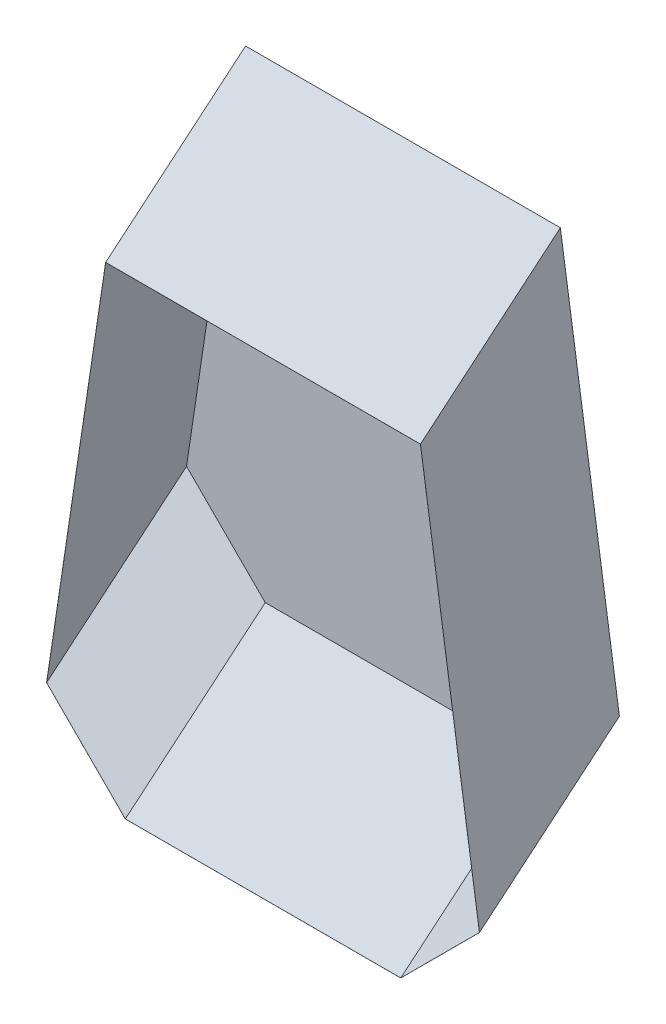
ISO-10303-21;
HEADER;
FILE_DESCRIPTION(('STEP AP214'),'2;1');
FILE_NAME('part.step','',(''),(''),'','','');
FILE_SCHEMA(('AUTOMOTIVE_DESIGN { 1 0 10303 214 1 1 1 1 }'));
ENDSEC;
DATA;
#1=APPLICATION_CONTEXT('core data for automotive mechanical design processes');
#2=APPLICATION_PROTOCOL_DEFINITION('international standard','automotive_design',2000,#1);
#3=PRODUCT_CONTEXT('',#1,'mechanical');
#4=PRODUCT('Part','Part','',(#3));
#5=PRODUCT_RELATED_PRODUCT_CATEGORY('part','',(#4));
#6=PRODUCT_DEFINITION_FORMATION('','',#4);
#7=PRODUCT_DEFINITION_CONTEXT('part definition',#1,'design');
#8=PRODUCT_DEFINITION('design','',#6,#7);
#9=PRODUCT_DEFINITION_SHAPE('','',#8);
#10=(LENGTH_UNIT() NAMED_UNIT(*) SI_UNIT(.MILLI.,.METRE.));
#11=(NAMED_UNIT(*) PLANE_ANGLE_UNIT() SI_UNIT($,.RADIAN.));
#12=(NAMED_UNIT(*) SI_UNIT($,.STERADIAN.) SOLID_ANGLE_UNIT());
#13=UNCERTAINTY_MEASURE_WITH_UNIT(LENGTH_MEASURE(1.E-05),#10,'distance_accuracy_value','');
#14=(GEOMETRIC_REPRESENTATION_CONTEXT(3) GLOBAL_UNCERTAINTY_ASSIGNED_CONTEXT((#13)) GLOBAL_UNIT_ASSIGNED_CONTEXT((#10,
#11,#12)) REPRESENTATION_CONTEXT('',''));
#15=CARTESIAN_POINT('',(0.,0.,0.));
#16=DIRECTION('',(0.,0.,1.));
#17=DIRECTION('',(1.,0.,0.));
#18=AXIS2_PLACEMENT_3D('',#15,#16,#17);
#19=CARTESIAN_POINT('',(-200.,-149.191914423321,502.8));
#20=DIRECTION('',(0.981363254877741,-0.147204488231661,-0.123519231782828));
#21=DIRECTION('',(0.148340452930245,0.988936352868298,0.));
#22=AXIS2_PLACEMENT_3D('',#19,#20,#21);
#23=PLANE('',#22);
#24=DIRECTION('',(-0.148340452930245,-0.988936352868298,0.));
#25=VECTOR('',#24,1.);
#26=CARTESIAN_POINT('',(-200.,0.,325.));
#27=LINE('',#26,#25);
#28=CARTESIAN_POINT('',(-200.,0.,325.));
#29=VERTEX_POINT('',#28);
#30=CARTESIAN_POINT('',(-275.,-500.,325.));
#31=VERTEX_POINT('',#30);
#32=EDGE_CURVE('E129',#29,#31,#27,.T.);
#33=ORIENTED_EDGE('',*,*,#32,.T.);
#34=DIRECTION('',(0.,0.642787609686541,-0.766044443118976));
#35=VECTOR('',#34,1.);
#36=CARTESIAN_POINT('',(-275.,-649.191914423321,502.8));
#37=LINE('',#36,#35);
#38=CARTESIAN_POINT('',(-275.,-649.191914423321,502.8));
#39=VERTEX_POINT('',#38);
#40=EDGE_CURVE('E11',#39,#31,#37,.T.);
#41=ORIENTED_EDGE('',*,*,#40,.F.);
#42=DIRECTION('',(-0.148340452930245,-0.988936352868298,0.));
#43=VECTOR('',#42,1.);
#44=CARTESIAN_POINT('',(-200.,-149.191914423321,502.8));
#45=LINE('',#44,#43);
#46=CARTESIAN_POINT('',(-200.,-149.191914423321,502.8));
#47=VERTEX_POINT('',#46);
#48=EDGE_CURVE('E141',#47,#39,#45,.T.);
#49=ORIENTED_EDGE('',*,*,#48,.F.);
#50=DIRECTION('',(0.,0.642787609686541,-0.766044443118976));
#51=VECTOR('',#50,1.);
#52=CARTESIAN_POINT('',(-200.,-149.191914423321,502.8));
#53=LINE('',#52,#51);
#54=EDGE_CURVE('E125',#47,#29,#53,.T.);
#55=ORIENTED_EDGE('',*,*,#54,.T.);
#56=EDGE_LOOP('',(#33,#41,#49,#55));
#57=FACE_BOUND('',#56,.T.);
#58=ADVANCED_FACE('F34',(#57),#23,.F.);
#59=CARTESIAN_POINT('',(-275.,-649.191914423321,502.8));
#60=DIRECTION('',(0.608120402411342,0.608120402411342,0.510273605374739));
#61=DIRECTION('',(-0.707106781186548,0.707106781186547,0.));
#62=AXIS2_PLACEMENT_3D('',#59,#60,#61);
#63=PLANE('',#62);
#64=DIRECTION('',(0.707106781186548,-0.707106781186547,0.));
#65=VECTOR('',#64,1.);
#66=CARTESIAN_POINT('',(-275.,-500.,325.));
#67=LINE('',#66,#65);
#68=CARTESIAN_POINT('',(-175.,-600.,325.));
#69=VERTEX_POINT('',#68);
#70=EDGE_CURVE('E132',#31,#69,#67,.T.);
#71=ORIENTED_EDGE('',*,*,#70,.T.);
#72=DIRECTION('',(0.,0.642787609686541,-0.766044443118976));
#73=VECTOR('',#72,1.);
#74=CARTESIAN_POINT('',(-175.,-749.191914423321,502.8));
#75=LINE('',#74,#73);
#76=CARTESIAN_POINT('',(-175.,-749.191914423321,502.8));
#77=VERTEX_POINT('',#76);
#78=EDGE_CURVE('E41',#77,#69,#75,.T.);
#79=ORIENTED_EDGE('',*,*,#78,.F.);
#80=DIRECTION('',(0.707106781186548,-0.707106781186547,0.));
#81=VECTOR('',#80,1.);
#82=CARTESIAN_POINT('',(-275.,-649.191914423321,502.8));
#83=LINE('',#82,#81);
#84=EDGE_CURVE('E92',#39,#77,#83,.T.);
#85=ORIENTED_EDGE('',*,*,#84,.F.);
#86=ORIENTED_EDGE('',*,*,#40,.T.);
#87=EDGE_LOOP('',(#71,#79,#85,#86));
#88=FACE_BOUND('',#87,.T.);
#89=ADVANCED_FACE('F264',(#88),#63,.F.);
#90=CARTESIAN_POINT('',(-175.,-749.191914423321,502.8));
#91=DIRECTION('',(0.,0.766044443118976,0.642787609686541));
#92=DIRECTION('',(0.,-0.642787609686541,0.766044443118976));
#93=AXIS2_PLACEMENT_3D('',#90,#91,#92);
#94=PLANE('',#93);
#95=DIRECTION('',(1.,0.,0.));
#96=VECTOR('',#95,1.);
#97=CARTESIAN_POINT('',(-175.,-600.,325.));
#98=LINE('',#97,#96);
#99=CARTESIAN_POINT('',(175.,-600.,325.));
#100=VERTEX_POINT('',#99);
#101=EDGE_CURVE('E135',#69,#100,#98,.T.);
#102=ORIENTED_EDGE('',*,*,#101,.T.);
#103=DIRECTION('',(0.,0.642787609686541,-0.766044443118976));
#104=VECTOR('',#103,1.);
#105=CARTESIAN_POINT('',(175.,-749.191914423321,502.8));
#106=LINE('',#105,#104);
#107=CARTESIAN_POINT('',(175.,-749.191914423321,502.8));
#108=VERTEX_POINT('',#107);
#109=EDGE_CURVE('E120',#108,#100,#106,.T.);
#110=ORIENTED_EDGE('',*,*,#109,.F.);
#111=DIRECTION('',(1.,0.,0.));
#112=VECTOR('',#111,1.);
#113=CARTESIAN_POINT('',(-175.,-749.191914423321,502.8));
#114=LINE('',#113,#112);
#115=EDGE_CURVE('E108',#77,#108,#114,.T.);
#116=ORIENTED_EDGE('',*,*,#115,.F.);
#117=ORIENTED_EDGE('',*,*,#78,.T.);
#118=EDGE_LOOP('',(#102,#110,#116,#117));
#119=FACE_BOUND('',#118,.T.);
#120=ADVANCED_FACE('F147',(#119),#94,.F.);
#121=CARTESIAN_POINT('',(175.,-749.191914423321,502.8));
#122=DIRECTION('',(-0.608120402411342,0.608120402411342,0.510273605374739));
#123=DIRECTION('',(-0.707106781186548,-0.707106781186547,0.));
#124=AXIS2_PLACEMENT_3D('',#121,#122,#123);
#125=PLANE('',#124);
#126=DIRECTION('',(0.707106781186548,0.707106781186547,0.));
#127=VECTOR('',#126,1.);
#128=CARTESIAN_POINT('',(175.,-600.,325.));
#129=LINE('',#128,#127);
#130=CARTESIAN_POINT('',(275.,-500.,325.));
#131=VERTEX_POINT('',#130);
#132=EDGE_CURVE('E117',#100,#131,#129,.T.);
#133=ORIENTED_EDGE('',*,*,#132,.T.);
#134=DIRECTION('',(0.,0.642787609686541,-0.766044443118976));
#135=VECTOR('',#134,1.);
#136=CARTESIAN_POINT('',(275.,-649.191914423321,502.8));
#137=LINE('',#136,#135);
#138=CARTESIAN_POINT('',(275.,-649.191914423321,502.8));
#139=VERTEX_POINT('',#138);
#140=EDGE_CURVE('E114',#139,#131,#137,.T.);
#141=ORIENTED_EDGE('',*,*,#140,.F.);
#142=DIRECTION('',(0.707106781186548,0.707106781186547,0.));
#143=VECTOR('',#142,1.);
#144=CARTESIAN_POINT('',(175.,-749.191914423321,502.8));
#145=LINE('',#144,#143);
#146=EDGE_CURVE('E101',#108,#139,#145,.T.);
#147=ORIENTED_EDGE('',*,*,#146,.F.);
#148=ORIENTED_EDGE('',*,*,#109,.T.);
#149=EDGE_LOOP('',(#133,#141,#147,#148));
#150=FACE_BOUND('',#149,.T.);
#151=ADVANCED_FACE('F115',(#150),#125,.F.);
#152=CARTESIAN_POINT('',(275.,-649.191914423321,502.8));
#153=DIRECTION('',(-0.981363254877741,-0.147204488231661,-0.123519231782828));
#154=DIRECTION('',(0.148340452930245,-0.988936352868298,0.));
#155=AXIS2_PLACEMENT_3D('',#152,#153,#154);
#156=PLANE('',#155);
#157=DIRECTION('',(-0.148340452930245,0.988936352868298,0.));
#158=VECTOR('',#157,1.);
#159=CARTESIAN_POINT('',(275.,-500.,325.));
#160=LINE('',#159,#158);
#161=CARTESIAN_POINT('',(200.,0.,325.));
#162=VERTEX_POINT('',#161);
#163=EDGE_CURVE('E138',#131,#162,#160,.T.);
#164=ORIENTED_EDGE('',*,*,#163,.T.);
#165=DIRECTION('',(0.,0.642787609686541,-0.766044443118976));
#166=VECTOR('',#165,1.);
#167=CARTESIAN_POINT('',(200.,-149.191914423321,502.8));
#168=LINE('',#167,#166);
#169=CARTESIAN_POINT('',(200.,-149.191914423321,502.8));
#170=VERTEX_POINT('',#169);
#171=EDGE_CURVE('E121',#170,#162,#168,.T.);
#172=ORIENTED_EDGE('',*,*,#171,.F.);
#173=DIRECTION('',(-0.148340452930245,0.988936352868298,0.));
#174=VECTOR('',#173,1.);
#175=CARTESIAN_POINT('',(275.,-649.191914423321,502.8));
#176=LINE('',#175,#174);
#177=EDGE_CURVE('E105',#139,#170,#176,.T.);
#178=ORIENTED_EDGE('',*,*,#177,.F.);
#179=ORIENTED_EDGE('',*,*,#140,.T.);
#180=EDGE_LOOP('',(#164,#172,#178,#179));
#181=FACE_BOUND('',#180,.T.);
#182=ADVANCED_FACE('F123',(#181),#156,.F.);
#183=CARTESIAN_POINT('',(200.,-149.191914423321,502.8));
#184=DIRECTION('',(0.,-0.766044443118976,-0.642787609686541));
#185=DIRECTION('',(0.,0.642787609686541,-0.766044443118976));
#186=AXIS2_PLACEMENT_3D('',#183,#184,#185);
#187=PLANE('',#186);
#188=DIRECTION('',(-1.,0.,0.));
#189=VECTOR('',#188,1.);
#190=CARTESIAN_POINT('',(200.,0.,325.));
#191=LINE('',#190,#189);
#192=EDGE_CURVE('E84',#162,#29,#191,.T.);
#193=ORIENTED_EDGE('',*,*,#192,.T.);
#194=ORIENTED_EDGE('',*,*,#54,.F.);
#195=DIRECTION('',(-1.,0.,0.));
#196=VECTOR('',#195,1.);
#197=CARTESIAN_POINT('',(200.,-149.191914423321,502.8));
#198=LINE('',#197,#196);
#199=EDGE_CURVE('E57',#170,#47,#198,.T.);
#200=ORIENTED_EDGE('',*,*,#199,.F.);
#201=ORIENTED_EDGE('',*,*,#171,.T.);
#202=EDGE_LOOP('',(#193,#194,#200,#201));
#203=FACE_BOUND('',#202,.T.);
#204=ADVANCED_FACE('F151',(#203),#187,.F.);
#205=CARTESIAN_POINT('',(0.,-149.191914423321,502.8));
#206=DIRECTION('',(0.,0.,1.));
#207=DIRECTION('',(1.,0.,0.));
#208=AXIS2_PLACEMENT_3D('',#205,#206,#207);
#209=PLANE('',#208);
#210=DIRECTION('',(-0.148340452930245,-0.988936352868298,0.));
#211=VECTOR('',#210,1.);
#212=CARTESIAN_POINT('',(-199.974687175548,-149.195711346989,502.8));
#213=LINE('',#212,#211);
#214=CARTESIAN_POINT('',(-199.97909123877,-149.22507176847,502.8));
#215=VERTEX_POINT('',#214);
#216=CARTESIAN_POINT('',(-274.972045591591,-649.178100787278,502.8));
#217=VERTEX_POINT('',#216);
#218=EDGE_CURVE('E172',#215,#217,#213,.T.);
#219=ORIENTED_EDGE('',*,*,#218,.F.);
#220=DIRECTION('',(-1.,0.,0.));
#221=VECTOR('',#220,1.);
#222=CARTESIAN_POINT('',(200.,-149.22507176847,502.8));
#223=LINE('',#222,#221);
#224=CARTESIAN_POINT('',(199.97909123877,-149.22507176847,502.8));
#225=VERTEX_POINT('',#224);
#226=EDGE_CURVE('E158',#225,#215,#223,.T.);
#227=ORIENTED_EDGE('',*,*,#226,.F.);
#228=DIRECTION('',(-0.148340452930245,0.988936352868298,0.));
#229=VECTOR('',#228,1.);
#230=CARTESIAN_POINT('',(274.974687175548,-649.195711346989,502.8));
#231=LINE('',#230,#229);
#232=CARTESIAN_POINT('',(274.972045591591,-649.178100787278,502.8));
#233=VERTEX_POINT('',#232);
#234=EDGE_CURVE('E161',#233,#225,#231,.T.);
#235=ORIENTED_EDGE('',*,*,#234,.F.);
#236=DIRECTION('',(0.707106781186548,0.707106781186547,0.));
#237=VECTOR('',#236,1.);
#238=CARTESIAN_POINT('',(174.979115977774,-749.171030401095,502.8));
#239=LINE('',#238,#237);
#240=CARTESIAN_POINT('',(174.991389300697,-749.158757078172,502.8));
#241=VERTEX_POINT('',#240);
#242=EDGE_CURVE('E163',#241,#233,#239,.T.);
#243=ORIENTED_EDGE('',*,*,#242,.F.);
#244=DIRECTION('',(1.,0.,0.));
#245=VECTOR('',#244,1.);
#246=CARTESIAN_POINT('',(-175.,-749.158757078172,502.8));
#247=LINE('',#246,#245);
#248=CARTESIAN_POINT('',(-174.991389300697,-749.158757078172,502.8));
#249=VERTEX_POINT('',#248);
#250=EDGE_CURVE('E166',#249,#241,#247,.T.);
#251=ORIENTED_EDGE('',*,*,#250,.F.);
#252=DIRECTION('',(0.707106781186548,-0.707106781186547,0.));
#253=VECTOR('',#252,1.);
#254=CARTESIAN_POINT('',(-274.979115977774,-649.171030401095,502.8));
#255=LINE('',#254,#253);
#256=EDGE_CURVE('E169',#217,#249,#255,.T.);
#257=ORIENTED_EDGE('',*,*,#256,.F.);
#258=EDGE_LOOP('',(#219,#227,#235,#243,#251,#257));
#259=FACE_BOUND('',#258,.T.);
#260=ORIENTED_EDGE('',*,*,#48,.T.);
#261=ORIENTED_EDGE('',*,*,#84,.T.);
#262=ORIENTED_EDGE('',*,*,#115,.T.);
#263=ORIENTED_EDGE('',*,*,#146,.T.);
#264=ORIENTED_EDGE('',*,*,#177,.T.);
#265=ORIENTED_EDGE('',*,*,#199,.T.);
#266=EDGE_LOOP('',(#260,#261,#262,#263,#264,#265));
#267=FACE_BOUND('',#266,.T.);
#268=ADVANCED_FACE('F103',(#259,#267),#209,.T.);
#269=CARTESIAN_POINT('',(0.,0.,325.));
#270=DIRECTION('',(0.,0.,1.));
#271=DIRECTION('',(1.,0.,0.));
#272=AXIS2_PLACEMENT_3D('',#269,#270,#271);
#273=PLANE('',#272);
#274=ORIENTED_EDGE('',*,*,#32,.F.);
#275=ORIENTED_EDGE('',*,*,#192,.F.);
#276=ORIENTED_EDGE('',*,*,#163,.F.);
#277=ORIENTED_EDGE('',*,*,#132,.F.);
#278=ORIENTED_EDGE('',*,*,#101,.F.);
#279=ORIENTED_EDGE('',*,*,#70,.F.);
#280=EDGE_LOOP('',(#274,#275,#276,#277,#278,#279));
#281=FACE_BOUND('',#280,.T.);
#282=ADVANCED_FACE('F150',(#281),#273,.F.);
#283=CARTESIAN_POINT('',(-199.975073373326,-149.195653417322,502.796862611513));
#284=DIRECTION('',(0.981363254877741,-0.147204488231661,-0.123519231782828));
#285=DIRECTION('',(0.148340452930245,0.988936352868298,0.));
#286=AXIS2_PLACEMENT_3D('',#283,#284,#285);
#287=PLANE('',#286);
#288=DIRECTION('',(-0.148340452930245,-0.988936352868298,0.));
#289=VECTOR('',#288,1.);
#290=CARTESIAN_POINT('',(-221.857904969096,-145.913228677957,325.0254));
#291=LINE('',#290,#289);
#292=CARTESIAN_POINT('',(-199.97909123877,-0.0544704757809798,325.0254));
#293=VERTEX_POINT('',#292);
#294=CARTESIAN_POINT('',(-274.972045591591,-500.007499494589,325.0254));
#295=VERTEX_POINT('',#294);
#296=EDGE_CURVE('E200',#293,#295,#291,.T.);
#297=ORIENTED_EDGE('',*,*,#296,.F.);
#298=DIRECTION('',(0.,0.642787609686541,-0.766044443118976));
#299=VECTOR('',#298,1.);
#300=CARTESIAN_POINT('',(-199.97909123877,-149.211371952176,502.783673194714));
#301=LINE('',#300,#299);
#302=EDGE_CURVE('E160',#215,#293,#301,.T.);
#303=ORIENTED_EDGE('',*,*,#302,.F.);
#304=ORIENTED_EDGE('',*,*,#218,.T.);
#305=DIRECTION('',(0.,0.642787609686541,-0.766044443118976));
#306=VECTOR('',#305,1.);
#307=CARTESIAN_POINT('',(-274.972045591591,-649.183808248937,502.806801887936));
#308=LINE('',#307,#306);
#309=EDGE_CURVE('E133',#217,#295,#308,.T.);
#310=ORIENTED_EDGE('',*,*,#309,.T.);
#311=EDGE_LOOP('',(#297,#303,#304,#310));
#312=FACE_BOUND('',#311,.T.);
#313=ADVANCED_FACE('F216',(#312),#287,.T.);
#314=CARTESIAN_POINT('',(-274.984553741779,-649.1764681651,502.812960949577));
#315=DIRECTION('',(0.608120402411342,0.608120402411342,0.510273605374739));
#316=DIRECTION('',(-0.707106781186548,0.707106781186547,0.));
#317=AXIS2_PLACEMENT_3D('',#314,#315,#316);
#318=PLANE('',#317);
#319=DIRECTION('',(0.707106781186548,-0.707106781186547,0.));
#320=VECTOR('',#319,1.);
#321=CARTESIAN_POINT('',(-200.393815331429,-574.585729754751,325.0254));
#322=LINE('',#321,#320);
#323=CARTESIAN_POINT('',(-174.991389300697,-599.988155785483,325.0254));
#324=VERTEX_POINT('',#323);
#325=EDGE_CURVE('E195',#295,#324,#322,.T.);
#326=ORIENTED_EDGE('',*,*,#325,.F.);
#327=ORIENTED_EDGE('',*,*,#309,.F.);
#328=ORIENTED_EDGE('',*,*,#256,.T.);
#329=DIRECTION('',(0.,0.642787609686541,-0.766044443118976));
#330=VECTOR('',#329,1.);
#331=CARTESIAN_POINT('',(-174.991389300697,-749.172456894466,502.816326805286));
#332=LINE('',#331,#330);
#333=EDGE_CURVE('E192',#249,#324,#332,.T.);
#334=ORIENTED_EDGE('',*,*,#333,.T.);
#335=EDGE_LOOP('',(#326,#327,#328,#334));
#336=FACE_BOUND('',#335,.T.);
#337=ADVANCED_FACE('F242',(#336),#318,.T.);
#338=CARTESIAN_POINT('',(-175.,-749.172456894466,502.816326805286));
#339=DIRECTION('',(0.,0.766044443118976,0.642787609686541));
#340=DIRECTION('',(0.,-0.642787609686541,0.766044443118976));
#341=AXIS2_PLACEMENT_3D('',#338,#339,#340);
#342=PLANE('',#341);
#343=DIRECTION('',(1.,0.,0.));
#344=VECTOR('',#343,1.);
#345=CARTESIAN_POINT('',(-175.,-599.988155785483,325.0254));
#346=LINE('',#345,#344);
#347=CARTESIAN_POINT('',(174.991389300697,-599.988155785483,325.0254));
#348=VERTEX_POINT('',#347);
#349=EDGE_CURVE('E189',#324,#348,#346,.T.);
#350=ORIENTED_EDGE('',*,*,#349,.F.);
#351=ORIENTED_EDGE('',*,*,#333,.F.);
#352=ORIENTED_EDGE('',*,*,#250,.T.);
#353=DIRECTION('',(0.,0.642787609686541,-0.766044443118976));
#354=VECTOR('',#353,1.);
#355=CARTESIAN_POINT('',(174.991389300697,-749.172456894466,502.816326805286));
#356=LINE('',#355,#354);
#357=EDGE_CURVE('E186',#241,#348,#356,.T.);
#358=ORIENTED_EDGE('',*,*,#357,.T.);
#359=EDGE_LOOP('',(#350,#351,#352,#358));
#360=FACE_BOUND('',#359,.T.);
#361=ADVANCED_FACE('F248',(#360),#342,.T.);
#362=CARTESIAN_POINT('',(174.984553741779,-749.1764681651,502.812960949577));
#363=DIRECTION('',(-0.608120402411342,0.608120402411342,0.510273605374739));
#364=DIRECTION('',(-0.707106781186548,-0.707106781186547,0.));
#365=AXIS2_PLACEMENT_3D('',#362,#363,#364);
#366=PLANE('',#365);
#367=DIRECTION('',(0.707106781186548,0.707106781186547,0.));
#368=VECTOR('',#367,1.);
#369=CARTESIAN_POINT('',(100.393815331429,-674.585729754751,325.0254));
#370=LINE('',#369,#368);
#371=CARTESIAN_POINT('',(274.972045591591,-500.007499494589,325.0254));
#372=VERTEX_POINT('',#371);
#373=EDGE_CURVE('E183',#348,#372,#370,.T.);
#374=ORIENTED_EDGE('',*,*,#373,.F.);
#375=ORIENTED_EDGE('',*,*,#357,.F.);
#376=ORIENTED_EDGE('',*,*,#242,.T.);
#377=DIRECTION('',(0.,0.642787609686541,-0.766044443118976));
#378=VECTOR('',#377,1.);
#379=CARTESIAN_POINT('',(274.972045591591,-649.183808248937,502.806801887936));
#380=LINE('',#379,#378);
#381=EDGE_CURVE('E180',#233,#372,#380,.T.);
#382=ORIENTED_EDGE('',*,*,#381,.T.);
#383=EDGE_LOOP('',(#374,#375,#376,#382));
#384=FACE_BOUND('',#383,.T.);
#385=ADVANCED_FACE('F252',(#384),#366,.T.);
#386=CARTESIAN_POINT('',(274.975073373326,-649.195653417322,502.796862611513));
#387=DIRECTION('',(-0.981363254877741,-0.147204488231661,-0.123519231782828));
#388=DIRECTION('',(0.148340452930245,-0.988936352868298,0.));
#389=AXIS2_PLACEMENT_3D('',#386,#387,#388);
#390=PLANE('',#389);
#391=DIRECTION('',(-0.148340452930245,0.988936352868298,0.));
#392=VECTOR('',#391,1.);
#393=CARTESIAN_POINT('',(296.857904969096,-645.913228677957,325.0254));
#394=LINE('',#393,#392);
#395=CARTESIAN_POINT('',(199.97909123877,-0.054470475780998,325.0254));
#396=VERTEX_POINT('',#395);
#397=EDGE_CURVE('E178',#372,#396,#394,.T.);
#398=ORIENTED_EDGE('',*,*,#397,.F.);
#399=ORIENTED_EDGE('',*,*,#381,.F.);
#400=ORIENTED_EDGE('',*,*,#234,.T.);
#401=DIRECTION('',(0.,0.642787609686541,-0.766044443118976));
#402=VECTOR('',#401,1.);
#403=CARTESIAN_POINT('',(199.97909123877,-149.211371952176,502.783673194714));
#404=LINE('',#403,#402);
#405=EDGE_CURVE('E48',#225,#396,#404,.T.);
#406=ORIENTED_EDGE('',*,*,#405,.T.);
#407=EDGE_LOOP('',(#398,#399,#400,#406));
#408=FACE_BOUND('',#407,.T.);
#409=ADVANCED_FACE('F254',(#408),#390,.T.);
#410=CARTESIAN_POINT('',(200.,-149.211371952176,502.783673194714));
#411=DIRECTION('',(0.,-0.766044443118976,-0.642787609686541));
#412=DIRECTION('',(0.,0.642787609686541,-0.766044443118976));
#413=AXIS2_PLACEMENT_3D('',#410,#411,#412);
#414=PLANE('',#413);
#415=DIRECTION('',(-1.,0.,0.));
#416=VECTOR('',#415,1.);
#417=CARTESIAN_POINT('',(200.,-0.0544704757809711,325.0254));
#418=LINE('',#417,#416);
#419=EDGE_CURVE('E175',#396,#293,#418,.T.);
#420=ORIENTED_EDGE('',*,*,#419,.F.);
#421=ORIENTED_EDGE('',*,*,#405,.F.);
#422=ORIENTED_EDGE('',*,*,#226,.T.);
#423=ORIENTED_EDGE('',*,*,#302,.T.);
#424=EDGE_LOOP('',(#420,#421,#422,#423));
#425=FACE_BOUND('',#424,.T.);
#426=ADVANCED_FACE('F236',(#425),#414,.T.);
#427=CARTESIAN_POINT('',(0.,0.,325.0254));
#428=DIRECTION('',(0.,0.,1.));
#429=DIRECTION('',(1.,0.,0.));
#430=AXIS2_PLACEMENT_3D('',#427,#428,#429);
#431=PLANE('',#430);
#432=ORIENTED_EDGE('',*,*,#296,.T.);
#433=ORIENTED_EDGE('',*,*,#325,.T.);
#434=ORIENTED_EDGE('',*,*,#349,.T.);
#435=ORIENTED_EDGE('',*,*,#373,.T.);
#436=ORIENTED_EDGE('',*,*,#397,.T.);
#437=ORIENTED_EDGE('',*,*,#419,.T.);
#438=EDGE_LOOP('',(#432,#433,#434,#435,#436,#437));
#439=FACE_BOUND('',#438,.T.);
#440=ADVANCED_FACE('F209',(#439),#431,.T.);
#441=CLOSED_SHELL('',(#58,#89,#120,#151,#182,#204,#268,#282,#313,#337,#361,#385,#409,#426,#440));
#442=MANIFOLD_SOLID_BREP('B2',#441);
#443=ADVANCED_BREP_SHAPE_REPRESENTATION('',(#18,#442),#14);
#444=SHAPE_DEFINITION_REPRESENTATION(#9,#443);
ENDSEC;
END-ISO-10303-21;
